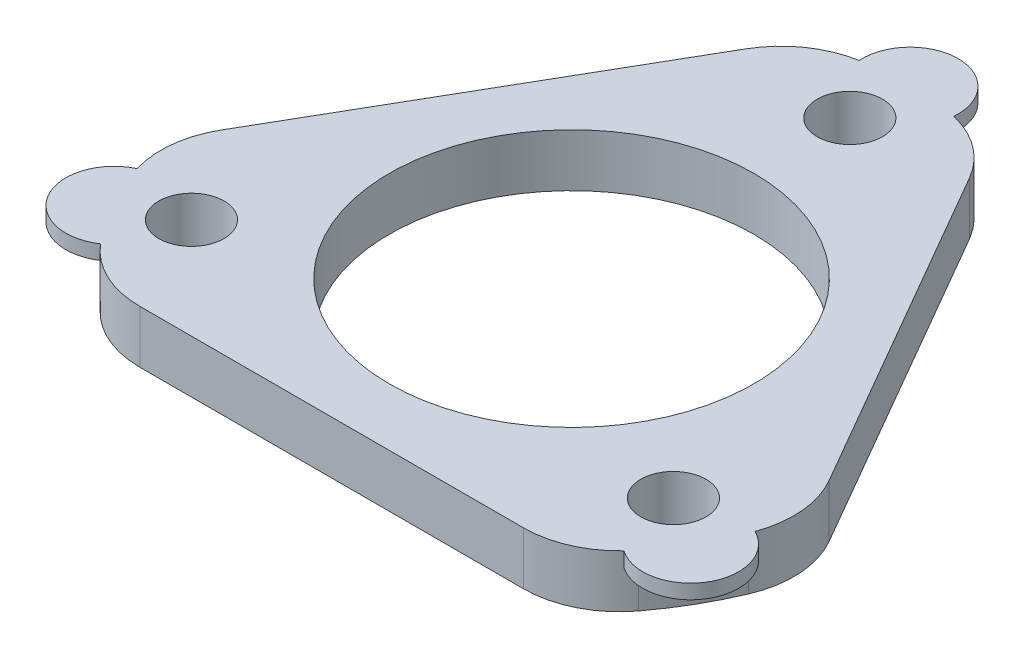
ISO-10303-21;
HEADER;
FILE_DESCRIPTION(('STEP AP214'),'2;1');
FILE_NAME('part.step','',(''),(''),'','','');
FILE_SCHEMA(('AUTOMOTIVE_DESIGN { 1 0 10303 214 1 1 1 1 }'));
ENDSEC;
DATA;
#1=APPLICATION_CONTEXT('core data for automotive mechanical design processes');
#2=APPLICATION_PROTOCOL_DEFINITION('international standard','automotive_design',2000,#1);
#3=PRODUCT_CONTEXT('',#1,'mechanical');
#4=PRODUCT('Part','Part','',(#3));
#5=PRODUCT_RELATED_PRODUCT_CATEGORY('part','',(#4));
#6=PRODUCT_DEFINITION_FORMATION('','',#4);
#7=PRODUCT_DEFINITION_CONTEXT('part definition',#1,'design');
#8=PRODUCT_DEFINITION('design','',#6,#7);
#9=PRODUCT_DEFINITION_SHAPE('','',#8);
#10=(LENGTH_UNIT() NAMED_UNIT(*) SI_UNIT(.MILLI.,.METRE.));
#11=(NAMED_UNIT(*) PLANE_ANGLE_UNIT() SI_UNIT($,.RADIAN.));
#12=(NAMED_UNIT(*) SI_UNIT($,.STERADIAN.) SOLID_ANGLE_UNIT());
#13=UNCERTAINTY_MEASURE_WITH_UNIT(LENGTH_MEASURE(1.E-05),#10,'distance_accuracy_value','');
#14=(GEOMETRIC_REPRESENTATION_CONTEXT(3) GLOBAL_UNCERTAINTY_ASSIGNED_CONTEXT((#13)) GLOBAL_UNIT_ASSIGNED_CONTEXT((#10,
#11,#12)) REPRESENTATION_CONTEXT('',''));
#15=CARTESIAN_POINT('',(0.,0.,0.));
#16=DIRECTION('',(0.,0.,1.));
#17=DIRECTION('',(1.,0.,0.));
#18=AXIS2_PLACEMENT_3D('',#15,#16,#17);
#19=CARTESIAN_POINT('',(0.,5.5,0.));
#20=DIRECTION('',(0.,1.,0.));
#21=DIRECTION('',(0.,0.,1.));
#22=AXIS2_PLACEMENT_3D('',#19,#20,#21);
#23=PLANE('',#22);
#24=CARTESIAN_POINT('',(0.,5.5,0.));
#25=DIRECTION('',(0.,1.,0.));
#26=DIRECTION('',(0.,0.,1.));
#27=AXIS2_PLACEMENT_3D('',#24,#25,#26);
#28=CIRCLE('',#27,19.);
#29=CARTESIAN_POINT('',(0.,5.5,19.));
#30=VERTEX_POINT('',#29);
#31=EDGE_CURVE('E560',#30,#30,#28,.T.);
#32=ORIENTED_EDGE('',*,*,#31,.F.);
#33=EDGE_LOOP('',(#32));
#34=FACE_BOUND('',#33,.T.);
#35=CARTESIAN_POINT('',(0.,5.5,-29.));
#36=DIRECTION('',(0.,1.,0.));
#37=DIRECTION('',(0.,0.,1.));
#38=AXIS2_PLACEMENT_3D('',#35,#36,#37);
#39=CIRCLE('',#38,3.4);
#40=CARTESIAN_POINT('',(0.,5.5,-25.6));
#41=VERTEX_POINT('',#40);
#42=EDGE_CURVE('E277',#41,#41,#39,.T.);
#43=ORIENTED_EDGE('',*,*,#42,.F.);
#44=EDGE_LOOP('',(#43));
#45=FACE_BOUND('',#44,.T.);
#46=CARTESIAN_POINT('',(25.1147367097487,5.5,14.5));
#47=DIRECTION('',(0.,1.,0.));
#48=DIRECTION('',(0.,0.,1.));
#49=AXIS2_PLACEMENT_3D('',#46,#47,#48);
#50=CIRCLE('',#49,3.4);
#51=CARTESIAN_POINT('',(25.1147367097487,5.5,17.9));
#52=VERTEX_POINT('',#51);
#53=EDGE_CURVE('E563',#52,#52,#50,.T.);
#54=ORIENTED_EDGE('',*,*,#53,.F.);
#55=EDGE_LOOP('',(#54));
#56=FACE_BOUND('',#55,.T.);
#57=CARTESIAN_POINT('',(-25.1147367097487,5.5,14.5));
#58=DIRECTION('',(0.,1.,0.));
#59=DIRECTION('',(0.,0.,1.));
#60=AXIS2_PLACEMENT_3D('',#57,#58,#59);
#61=CIRCLE('',#60,3.4);
#62=CARTESIAN_POINT('',(-25.1147367097487,5.5,17.9));
#63=VERTEX_POINT('',#62);
#64=EDGE_CURVE('E292',#63,#63,#61,.T.);
#65=ORIENTED_EDGE('',*,*,#64,.F.);
#66=EDGE_LOOP('',(#65));
#67=FACE_BOUND('',#66,.T.);
#68=CARTESIAN_POINT('',(-30.4536294819663,5.5,17.2504043829445));
#69=DIRECTION('',(0.,1.,0.));
#70=DIRECTION('',(0.,0.,1.));
#71=AXIS2_PLACEMENT_3D('',#68,#69,#70);
#72=CIRCLE('',#71,5.);
#73=CARTESIAN_POINT('',(-32.5618339352836,5.5,12.7165898760405));
#74=VERTEX_POINT('',#73);
#75=CARTESIAN_POINT('',(-27.6767457832055,5.5,21.4083987219927));
#76=VERTEX_POINT('',#75);
#77=EDGE_CURVE('E302',#74,#76,#72,.T.);
#78=ORIENTED_EDGE('',*,*,#77,.T.);
#79=CARTESIAN_POINT('',(-20.,5.5,15.));
#80=DIRECTION('',(0.,1.,0.));
#81=DIRECTION('',(0.,0.,1.));
#82=AXIS2_PLACEMENT_3D('',#79,#80,#81);
#83=CIRCLE('',#82,10.);
#84=CARTESIAN_POINT('',(-20.,5.5,25.));
#85=VERTEX_POINT('',#84);
#86=EDGE_CURVE('E224',#76,#85,#83,.T.);
#87=ORIENTED_EDGE('',*,*,#86,.T.);
#88=DIRECTION('',(1.,0.,0.));
#89=VECTOR('',#88,1.);
#90=CARTESIAN_POINT('',(-43.301270189222,5.5,25.));
#91=LINE('',#90,#89);
#92=CARTESIAN_POINT('',(20.,5.5,25.));
#93=VERTEX_POINT('',#92);
#94=EDGE_CURVE('E183',#85,#93,#91,.T.);
#95=ORIENTED_EDGE('',*,*,#94,.T.);
#96=CARTESIAN_POINT('',(20.,5.5,15.));
#97=DIRECTION('',(0.,1.,0.));
#98=DIRECTION('',(0.,0.,1.));
#99=AXIS2_PLACEMENT_3D('',#96,#97,#98);
#100=CIRCLE('',#99,10.);
#101=CARTESIAN_POINT('',(27.2938068498009,5.5,21.8410804437455));
#102=VERTEX_POINT('',#101);
#103=EDGE_CURVE('E218',#93,#102,#100,.T.);
#104=ORIENTED_EDGE('',*,*,#103,.T.);
#105=CARTESIAN_POINT('',(30.1661031621676,5.5,17.7484145773493));
#106=DIRECTION('',(0.,1.,0.));
#107=DIRECTION('',(0.,0.,1.));
#108=AXIS2_PLACEMENT_3D('',#105,#106,#107);
#109=CIRCLE('',#108,5.);
#110=CARTESIAN_POINT('',(32.3785900391947,5.5,13.2645655813434));
#111=VERTEX_POINT('',#110);
#112=EDGE_CURVE('E296',#102,#111,#109,.T.);
#113=ORIENTED_EDGE('',*,*,#112,.T.);
#114=CARTESIAN_POINT('',(22.9903810567666,5.5,9.82050807568875));
#115=DIRECTION('',(0.,1.,0.));
#116=DIRECTION('',(0.,0.,1.));
#117=AXIS2_PLACEMENT_3D('',#114,#115,#116);
#118=CIRCLE('',#117,10.);
#119=CARTESIAN_POINT('',(31.650635094611,5.5,4.82050807568876));
#120=VERTEX_POINT('',#119);
#121=EDGE_CURVE('E216',#111,#120,#118,.T.);
#122=ORIENTED_EDGE('',*,*,#121,.T.);
#123=DIRECTION('',(-0.5,0.,-0.866025403784438));
#124=VECTOR('',#123,1.);
#125=CARTESIAN_POINT('',(43.301270189222,5.5,25.));
#126=LINE('',#125,#124);
#127=CARTESIAN_POINT('',(11.650635094611,5.5,-29.8205080756888));
#128=VERTEX_POINT('',#127);
#129=EDGE_CURVE('E281',#120,#128,#126,.T.);
#130=ORIENTED_EDGE('',*,*,#129,.T.);
#131=CARTESIAN_POINT('',(2.9903810567666,5.5,-24.8205080756888));
#132=DIRECTION('',(0.,1.,0.));
#133=DIRECTION('',(0.,0.,1.));
#134=AXIS2_PLACEMENT_3D('',#131,#132,#133);
#135=CIRCLE('',#134,10.);
#136=CARTESIAN_POINT('',(5.26802708548266,5.5,-34.5576703197861));
#137=VERTEX_POINT('',#136);
#138=EDGE_CURVE('E213',#128,#137,#135,.T.);
#139=ORIENTED_EDGE('',*,*,#138,.T.);
#140=CARTESIAN_POINT('',(0.287526319798734,5.5,-34.9988189602938));
#141=DIRECTION('',(0.,1.,0.));
#142=DIRECTION('',(0.,0.,1.));
#143=AXIS2_PLACEMENT_3D('',#140,#141,#142);
#144=CIRCLE('',#143,5.);
#145=CARTESIAN_POINT('',(-4.70184425598925,5.5,-34.6729643033361));
#146=VERTEX_POINT('',#145);
#147=EDGE_CURVE('E299',#137,#146,#144,.T.);
#148=ORIENTED_EDGE('',*,*,#147,.T.);
#149=CARTESIAN_POINT('',(-2.99038105676657,5.5,-24.8205080756888));
#150=DIRECTION('',(0.,1.,0.));
#151=DIRECTION('',(0.,0.,1.));
#152=AXIS2_PLACEMENT_3D('',#149,#150,#151);
#153=CIRCLE('',#152,10.);
#154=CARTESIAN_POINT('',(-11.650635094611,5.5,-29.8205080756888));
#155=VERTEX_POINT('',#154);
#156=EDGE_CURVE('E211',#146,#155,#153,.T.);
#157=ORIENTED_EDGE('',*,*,#156,.T.);
#158=DIRECTION('',(-0.5,0.,0.866025403784438));
#159=VECTOR('',#158,1.);
#160=CARTESIAN_POINT('',(0.,5.5,-50.));
#161=LINE('',#160,#159);
#162=CARTESIAN_POINT('',(-31.650635094611,5.5,4.82050807568876));
#163=VERTEX_POINT('',#162);
#164=EDGE_CURVE('E285',#155,#163,#161,.T.);
#165=ORIENTED_EDGE('',*,*,#164,.T.);
#166=CARTESIAN_POINT('',(-22.9903810567666,5.5,9.82050807568877));
#167=DIRECTION('',(0.,1.,0.));
#168=DIRECTION('',(0.,0.,1.));
#169=AXIS2_PLACEMENT_3D('',#166,#167,#168);
#170=CIRCLE('',#169,10.);
#171=EDGE_CURVE('E221',#163,#74,#170,.T.);
#172=ORIENTED_EDGE('',*,*,#171,.T.);
#173=EDGE_LOOP('',(#78,#87,#95,#104,#113,#122,#130,#139,#148,#157,#165,#172));
#174=FACE_BOUND('',#173,.T.);
#175=ADVANCED_FACE('F37',(#34,#45,#56,#67,#174),#23,.T.);
#176=CARTESIAN_POINT('',(0.,5.5,0.));
#177=DIRECTION('',(0.,-1.,0.));
#178=DIRECTION('',(0.,0.,-1.));
#179=AXIS2_PLACEMENT_3D('',#176,#177,#178);
#180=CYLINDRICAL_SURFACE('',#179,35.);
#181=CARTESIAN_POINT('',(0.,4.,0.));
#182=DIRECTION('',(0.,1.,0.));
#183=DIRECTION('',(0.,0.,1.));
#184=AXIS2_PLACEMENT_3D('',#181,#182,#183);
#185=CIRCLE('',#184,35.);
#186=CARTESIAN_POINT('',(28.,4.,21.));
#187=VERTEX_POINT('',#186);
#188=CARTESIAN_POINT('',(32.1865334794732,4.,13.7487113059643));
#189=VERTEX_POINT('',#188);
#190=EDGE_CURVE('E197',#187,#189,#185,.T.);
#191=ORIENTED_EDGE('',*,*,#190,.F.);
#192=DIRECTION('',(0.,-1.,0.));
#193=VECTOR('',#192,1.);
#194=CARTESIAN_POINT('',(28.,5.5,21.));
#195=LINE('',#194,#193);
#196=CARTESIAN_POINT('',(28.,0.,21.));
#197=VERTEX_POINT('',#196);
#198=EDGE_CURVE('E234',#187,#197,#195,.T.);
#199=ORIENTED_EDGE('',*,*,#198,.T.);
#200=CARTESIAN_POINT('',(0.,0.,0.));
#201=DIRECTION('',(0.,1.,0.));
#202=DIRECTION('',(0.,0.,1.));
#203=AXIS2_PLACEMENT_3D('',#200,#201,#202);
#204=CIRCLE('',#203,35.);
#205=CARTESIAN_POINT('',(32.1865334794732,0.,13.7487113059643));
#206=VERTEX_POINT('',#205);
#207=EDGE_CURVE('E311',#197,#206,#204,.T.);
#208=ORIENTED_EDGE('',*,*,#207,.T.);
#209=DIRECTION('',(0.,-1.,0.));
#210=VECTOR('',#209,1.);
#211=CARTESIAN_POINT('',(32.1865334794732,5.5,13.7487113059643));
#212=LINE('',#211,#210);
#213=EDGE_CURVE('E232',#206,#189,#212,.F.);
#214=ORIENTED_EDGE('',*,*,#213,.T.);
#215=EDGE_LOOP('',(#191,#199,#208,#214));
#216=FACE_BOUND('',#215,.T.);
#217=ADVANCED_FACE('F337',(#216),#180,.T.);
#218=CARTESIAN_POINT('',(0.,4.,0.));
#219=DIRECTION('',(0.,1.,0.));
#220=DIRECTION('',(0.,0.,1.));
#221=AXIS2_PLACEMENT_3D('',#218,#219,#220);
#222=CIRCLE('',#221,35.);
#223=CARTESIAN_POINT('',(4.18653347947323,4.,-34.7487113059643));
#224=VERTEX_POINT('',#223);
#225=CARTESIAN_POINT('',(-4.1865334794732,4.,-34.7487113059643));
#226=VERTEX_POINT('',#225);
#227=EDGE_CURVE('E315',#224,#226,#222,.T.);
#228=ORIENTED_EDGE('',*,*,#227,.F.);
#229=DIRECTION('',(0.,-1.,0.));
#230=VECTOR('',#229,1.);
#231=CARTESIAN_POINT('',(4.18653347947323,5.5,-34.7487113059643));
#232=LINE('',#231,#230);
#233=CARTESIAN_POINT('',(4.18653347947323,0.,-34.7487113059643));
#234=VERTEX_POINT('',#233);
#235=EDGE_CURVE('E244',#224,#234,#232,.T.);
#236=ORIENTED_EDGE('',*,*,#235,.T.);
#237=CARTESIAN_POINT('',(-4.1865334794732,0.,-34.7487113059643));
#238=VERTEX_POINT('',#237);
#239=EDGE_CURVE('E308',#234,#238,#204,.T.);
#240=ORIENTED_EDGE('',*,*,#239,.T.);
#241=DIRECTION('',(0.,-1.,0.));
#242=VECTOR('',#241,1.);
#243=CARTESIAN_POINT('',(-4.1865334794732,5.5,-34.7487113059643));
#244=LINE('',#243,#242);
#245=EDGE_CURVE('E242',#238,#226,#244,.F.);
#246=ORIENTED_EDGE('',*,*,#245,.T.);
#247=EDGE_LOOP('',(#228,#236,#240,#246));
#248=FACE_BOUND('',#247,.T.);
#249=ADVANCED_FACE('F363',(#248),#180,.T.);
#250=CARTESIAN_POINT('',(-32.1865334794732,0.,13.7487113059643));
#251=VERTEX_POINT('',#250);
#252=CARTESIAN_POINT('',(-28.,0.,21.));
#253=VERTEX_POINT('',#252);
#254=EDGE_CURVE('E306',#251,#253,#204,.T.);
#255=ORIENTED_EDGE('',*,*,#254,.T.);
#256=DIRECTION('',(0.,-1.,0.));
#257=VECTOR('',#256,1.);
#258=CARTESIAN_POINT('',(-28.,5.5,21.));
#259=LINE('',#258,#257);
#260=CARTESIAN_POINT('',(-28.,4.,21.));
#261=VERTEX_POINT('',#260);
#262=EDGE_CURVE('E167',#253,#261,#259,.F.);
#263=ORIENTED_EDGE('',*,*,#262,.T.);
#264=CARTESIAN_POINT('',(0.,4.,0.));
#265=DIRECTION('',(0.,1.,0.));
#266=DIRECTION('',(0.,0.,1.));
#267=AXIS2_PLACEMENT_3D('',#264,#265,#266);
#268=CIRCLE('',#267,35.);
#269=CARTESIAN_POINT('',(-32.1865334794732,4.,13.7487113059643));
#270=VERTEX_POINT('',#269);
#271=EDGE_CURVE('E312',#270,#261,#268,.T.);
#272=ORIENTED_EDGE('',*,*,#271,.F.);
#273=DIRECTION('',(0.,-1.,0.));
#274=VECTOR('',#273,1.);
#275=CARTESIAN_POINT('',(-32.1865334794732,5.5,13.7487113059643));
#276=LINE('',#275,#274);
#277=EDGE_CURVE('E172',#270,#251,#276,.T.);
#278=ORIENTED_EDGE('',*,*,#277,.T.);
#279=EDGE_LOOP('',(#255,#263,#272,#278));
#280=FACE_BOUND('',#279,.T.);
#281=ADVANCED_FACE('F340',(#280),#180,.T.);
#282=CARTESIAN_POINT('',(0.,0.,0.));
#283=DIRECTION('',(0.,1.,0.));
#284=DIRECTION('',(0.,0.,1.));
#285=AXIS2_PLACEMENT_3D('',#282,#283,#284);
#286=PLANE('',#285);
#287=CARTESIAN_POINT('',(0.,0.,0.));
#288=DIRECTION('',(0.,1.,0.));
#289=DIRECTION('',(0.,0.,1.));
#290=AXIS2_PLACEMENT_3D('',#287,#288,#289);
#291=CIRCLE('',#290,19.);
#292=CARTESIAN_POINT('',(0.,0.,19.));
#293=VERTEX_POINT('',#292);
#294=EDGE_CURVE('E41',#293,#293,#291,.T.);
#295=ORIENTED_EDGE('',*,*,#294,.T.);
#296=EDGE_LOOP('',(#295));
#297=FACE_BOUND('',#296,.T.);
#298=CARTESIAN_POINT('',(0.,0.,-29.));
#299=DIRECTION('',(0.,1.,0.));
#300=DIRECTION('',(0.,0.,1.));
#301=AXIS2_PLACEMENT_3D('',#298,#299,#300);
#302=CIRCLE('',#301,3.4);
#303=CARTESIAN_POINT('',(0.,0.,-25.6));
#304=VERTEX_POINT('',#303);
#305=EDGE_CURVE('E279',#304,#304,#302,.T.);
#306=ORIENTED_EDGE('',*,*,#305,.T.);
#307=EDGE_LOOP('',(#306));
#308=FACE_BOUND('',#307,.T.);
#309=CARTESIAN_POINT('',(25.1147367097487,0.,14.5));
#310=DIRECTION('',(0.,1.,0.));
#311=DIRECTION('',(0.,0.,1.));
#312=AXIS2_PLACEMENT_3D('',#309,#310,#311);
#313=CIRCLE('',#312,3.4);
#314=CARTESIAN_POINT('',(25.1147367097487,0.,17.9));
#315=VERTEX_POINT('',#314);
#316=EDGE_CURVE('E276',#315,#315,#313,.T.);
#317=ORIENTED_EDGE('',*,*,#316,.T.);
#318=EDGE_LOOP('',(#317));
#319=FACE_BOUND('',#318,.T.);
#320=CARTESIAN_POINT('',(-25.1147367097487,0.,14.5));
#321=DIRECTION('',(0.,1.,0.));
#322=DIRECTION('',(0.,0.,1.));
#323=AXIS2_PLACEMENT_3D('',#320,#321,#322);
#324=CIRCLE('',#323,3.4);
#325=CARTESIAN_POINT('',(-25.1147367097487,0.,17.9));
#326=VERTEX_POINT('',#325);
#327=EDGE_CURVE('E273',#326,#326,#324,.T.);
#328=ORIENTED_EDGE('',*,*,#327,.T.);
#329=EDGE_LOOP('',(#328));
#330=FACE_BOUND('',#329,.T.);
#331=DIRECTION('',(1.,0.,0.));
#332=VECTOR('',#331,1.);
#333=CARTESIAN_POINT('',(0.,0.,25.));
#334=LINE('',#333,#332);
#335=CARTESIAN_POINT('',(-20.,0.,25.));
#336=VERTEX_POINT('',#335);
#337=CARTESIAN_POINT('',(20.,0.,25.));
#338=VERTEX_POINT('',#337);
#339=EDGE_CURVE('E180',#336,#338,#334,.T.);
#340=ORIENTED_EDGE('',*,*,#339,.F.);
#341=CARTESIAN_POINT('',(-20.,0.,15.));
#342=DIRECTION('',(0.,1.,0.));
#343=DIRECTION('',(0.,0.,1.));
#344=AXIS2_PLACEMENT_3D('',#341,#342,#343);
#345=CIRCLE('',#344,10.);
#346=EDGE_CURVE('E161',#336,#253,#345,.F.);
#347=ORIENTED_EDGE('',*,*,#346,.T.);
#348=ORIENTED_EDGE('',*,*,#254,.F.);
#349=CARTESIAN_POINT('',(-22.9903810567666,0.,9.82050807568877));
#350=DIRECTION('',(0.,1.,0.));
#351=DIRECTION('',(0.,0.,1.));
#352=AXIS2_PLACEMENT_3D('',#349,#350,#351);
#353=CIRCLE('',#352,10.);
#354=CARTESIAN_POINT('',(-31.650635094611,0.,4.82050807568878));
#355=VERTEX_POINT('',#354);
#356=EDGE_CURVE('E173',#251,#355,#353,.F.);
#357=ORIENTED_EDGE('',*,*,#356,.T.);
#358=DIRECTION('',(-0.5,0.,0.866025403784439));
#359=VECTOR('',#358,1.);
#360=CARTESIAN_POINT('',(-21.650635094611,0.,-12.5));
#361=LINE('',#360,#359);
#362=CARTESIAN_POINT('',(-11.650635094611,0.,-29.8205080756888));
#363=VERTEX_POINT('',#362);
#364=EDGE_CURVE('E192',#363,#355,#361,.T.);
#365=ORIENTED_EDGE('',*,*,#364,.F.);
#366=CARTESIAN_POINT('',(-2.99038105676657,0.,-24.8205080756888));
#367=DIRECTION('',(0.,1.,0.));
#368=DIRECTION('',(0.,0.,1.));
#369=AXIS2_PLACEMENT_3D('',#366,#367,#368);
#370=CIRCLE('',#369,10.);
#371=EDGE_CURVE('E184',#363,#238,#370,.F.);
#372=ORIENTED_EDGE('',*,*,#371,.T.);
#373=ORIENTED_EDGE('',*,*,#239,.F.);
#374=CARTESIAN_POINT('',(2.9903810567666,0.,-24.8205080756888));
#375=DIRECTION('',(0.,1.,0.));
#376=DIRECTION('',(0.,0.,1.));
#377=AXIS2_PLACEMENT_3D('',#374,#375,#376);
#378=CIRCLE('',#377,10.);
#379=CARTESIAN_POINT('',(11.650635094611,0.,-29.8205080756888));
#380=VERTEX_POINT('',#379);
#381=EDGE_CURVE('E203',#234,#380,#378,.F.);
#382=ORIENTED_EDGE('',*,*,#381,.T.);
#383=DIRECTION('',(-0.5,0.,-0.866025403784439));
#384=VECTOR('',#383,1.);
#385=CARTESIAN_POINT('',(21.650635094611,0.,-12.5));
#386=LINE('',#385,#384);
#387=CARTESIAN_POINT('',(31.650635094611,0.,4.82050807568876));
#388=VERTEX_POINT('',#387);
#389=EDGE_CURVE('E191',#388,#380,#386,.T.);
#390=ORIENTED_EDGE('',*,*,#389,.F.);
#391=CARTESIAN_POINT('',(22.9903810567666,0.,9.82050807568875));
#392=DIRECTION('',(0.,1.,0.));
#393=DIRECTION('',(0.,0.,1.));
#394=AXIS2_PLACEMENT_3D('',#391,#392,#393);
#395=CIRCLE('',#394,10.);
#396=EDGE_CURVE('E205',#388,#206,#395,.F.);
#397=ORIENTED_EDGE('',*,*,#396,.T.);
#398=ORIENTED_EDGE('',*,*,#207,.F.);
#399=CARTESIAN_POINT('',(20.,0.,15.));
#400=DIRECTION('',(0.,1.,0.));
#401=DIRECTION('',(0.,0.,1.));
#402=AXIS2_PLACEMENT_3D('',#399,#400,#401);
#403=CIRCLE('',#402,10.);
#404=EDGE_CURVE('E190',#197,#338,#403,.F.);
#405=ORIENTED_EDGE('',*,*,#404,.T.);
#406=EDGE_LOOP('',(#340,#347,#348,#357,#365,#372,#373,#382,#390,#397,#398,#405));
#407=FACE_BOUND('',#406,.T.);
#408=ADVANCED_FACE('F187',(#297,#308,#319,#330,#407),#286,.F.);
#409=CARTESIAN_POINT('',(-30.4536294819663,4.,17.2504043829445));
#410=DIRECTION('',(0.,1.,0.));
#411=DIRECTION('',(0.,0.,1.));
#412=AXIS2_PLACEMENT_3D('',#409,#410,#411);
#413=CYLINDRICAL_SURFACE('',#412,5.);
#414=ORIENTED_EDGE('',*,*,#77,.F.);
#415=DIRECTION('',(0.,1.,0.));
#416=VECTOR('',#415,1.);
#417=CARTESIAN_POINT('',(-32.5618339352836,5.5,12.7165898760405));
#418=LINE('',#417,#416);
#419=CARTESIAN_POINT('',(-32.5618339352836,4.,12.7165898760405));
#420=VERTEX_POINT('',#419);
#421=EDGE_CURVE('E252',#74,#420,#418,.F.);
#422=ORIENTED_EDGE('',*,*,#421,.T.);
#423=CARTESIAN_POINT('',(-30.4536294819663,4.,17.2504043829445));
#424=DIRECTION('',(0.,1.,0.));
#425=DIRECTION('',(0.,0.,1.));
#426=AXIS2_PLACEMENT_3D('',#423,#424,#425);
#427=CIRCLE('',#426,5.);
#428=CARTESIAN_POINT('',(-27.6767457832055,4.,21.4083987219927));
#429=VERTEX_POINT('',#428);
#430=EDGE_CURVE('E304',#420,#429,#427,.T.);
#431=ORIENTED_EDGE('',*,*,#430,.T.);
#432=DIRECTION('',(0.,1.,0.));
#433=VECTOR('',#432,1.);
#434=CARTESIAN_POINT('',(-27.6767457832055,4.,21.4083987219927));
#435=LINE('',#434,#433);
#436=EDGE_CURVE('E249',#429,#76,#435,.T.);
#437=ORIENTED_EDGE('',*,*,#436,.T.);
#438=EDGE_LOOP('',(#414,#422,#431,#437));
#439=FACE_BOUND('',#438,.T.);
#440=ADVANCED_FACE('F395',(#439),#413,.T.);
#441=CARTESIAN_POINT('',(-30.4536294819663,4.,17.2504043829445));
#442=DIRECTION('',(0.,1.,0.));
#443=DIRECTION('',(0.,0.,1.));
#444=AXIS2_PLACEMENT_3D('',#441,#442,#443);
#445=PLANE('',#444);
#446=ORIENTED_EDGE('',*,*,#430,.F.);
#447=CARTESIAN_POINT('',(-22.9903810567666,4.,9.82050807568877));
#448=DIRECTION('',(0.,1.,0.));
#449=DIRECTION('',(0.,0.,1.));
#450=AXIS2_PLACEMENT_3D('',#447,#448,#449);
#451=CIRCLE('',#450,10.);
#452=EDGE_CURVE('E255',#420,#270,#451,.T.);
#453=ORIENTED_EDGE('',*,*,#452,.T.);
#454=ORIENTED_EDGE('',*,*,#271,.T.);
#455=CARTESIAN_POINT('',(-20.,4.,15.));
#456=DIRECTION('',(0.,1.,0.));
#457=DIRECTION('',(0.,0.,1.));
#458=AXIS2_PLACEMENT_3D('',#455,#456,#457);
#459=CIRCLE('',#458,10.);
#460=EDGE_CURVE('E246',#261,#429,#459,.T.);
#461=ORIENTED_EDGE('',*,*,#460,.T.);
#462=EDGE_LOOP('',(#446,#453,#454,#461));
#463=FACE_BOUND('',#462,.T.);
#464=ADVANCED_FACE('F437',(#463),#445,.F.);
#465=CARTESIAN_POINT('',(0.287526319798734,4.,-34.9988189602938));
#466=DIRECTION('',(0.,1.,0.));
#467=DIRECTION('',(0.,0.,1.));
#468=AXIS2_PLACEMENT_3D('',#465,#466,#467);
#469=CYLINDRICAL_SURFACE('',#468,5.);
#470=ORIENTED_EDGE('',*,*,#147,.F.);
#471=DIRECTION('',(0.,1.,0.));
#472=VECTOR('',#471,1.);
#473=CARTESIAN_POINT('',(5.26802708548266,5.5,-34.5576703197861));
#474=LINE('',#473,#472);
#475=CARTESIAN_POINT('',(5.26802708548266,4.,-34.5576703197861));
#476=VERTEX_POINT('',#475);
#477=EDGE_CURVE('E268',#137,#476,#474,.F.);
#478=ORIENTED_EDGE('',*,*,#477,.T.);
#479=CARTESIAN_POINT('',(0.287526319798734,4.,-34.9988189602938));
#480=DIRECTION('',(0.,1.,0.));
#481=DIRECTION('',(0.,0.,1.));
#482=AXIS2_PLACEMENT_3D('',#479,#480,#481);
#483=CIRCLE('',#482,5.);
#484=CARTESIAN_POINT('',(-4.70184425598925,4.,-34.6729643033361));
#485=VERTEX_POINT('',#484);
#486=EDGE_CURVE('E53',#476,#485,#483,.T.);
#487=ORIENTED_EDGE('',*,*,#486,.T.);
#488=DIRECTION('',(0.,1.,0.));
#489=VECTOR('',#488,1.);
#490=CARTESIAN_POINT('',(-4.70184425598925,4.,-34.6729643033361));
#491=LINE('',#490,#489);
#492=EDGE_CURVE('E11',#485,#146,#491,.T.);
#493=ORIENTED_EDGE('',*,*,#492,.T.);
#494=EDGE_LOOP('',(#470,#478,#487,#493));
#495=FACE_BOUND('',#494,.T.);
#496=ADVANCED_FACE('F434',(#495),#469,.T.);
#497=CARTESIAN_POINT('',(0.287526319798734,4.,-34.9988189602938));
#498=DIRECTION('',(0.,1.,0.));
#499=DIRECTION('',(0.,0.,1.));
#500=AXIS2_PLACEMENT_3D('',#497,#498,#499);
#501=PLANE('',#500);
#502=ORIENTED_EDGE('',*,*,#486,.F.);
#503=CARTESIAN_POINT('',(2.9903810567666,4.,-24.8205080756888));
#504=DIRECTION('',(0.,1.,0.));
#505=DIRECTION('',(0.,0.,1.));
#506=AXIS2_PLACEMENT_3D('',#503,#504,#505);
#507=CIRCLE('',#506,10.);
#508=EDGE_CURVE('E270',#476,#224,#507,.T.);
#509=ORIENTED_EDGE('',*,*,#508,.T.);
#510=ORIENTED_EDGE('',*,*,#227,.T.);
#511=CARTESIAN_POINT('',(-2.99038105676657,4.,-24.8205080756888));
#512=DIRECTION('',(0.,1.,0.));
#513=DIRECTION('',(0.,0.,1.));
#514=AXIS2_PLACEMENT_3D('',#511,#512,#513);
#515=CIRCLE('',#514,10.);
#516=EDGE_CURVE('E46',#226,#485,#515,.T.);
#517=ORIENTED_EDGE('',*,*,#516,.T.);
#518=EDGE_LOOP('',(#502,#509,#510,#517));
#519=FACE_BOUND('',#518,.T.);
#520=ADVANCED_FACE('F365',(#519),#501,.F.);
#521=CARTESIAN_POINT('',(30.1661031621676,4.,17.7484145773493));
#522=DIRECTION('',(0.,1.,0.));
#523=DIRECTION('',(0.,0.,1.));
#524=AXIS2_PLACEMENT_3D('',#521,#522,#523);
#525=CYLINDRICAL_SURFACE('',#524,5.);
#526=ORIENTED_EDGE('',*,*,#112,.F.);
#527=DIRECTION('',(0.,1.,0.));
#528=VECTOR('',#527,1.);
#529=CARTESIAN_POINT('',(27.2938068498009,5.5,21.8410804437455));
#530=LINE('',#529,#528);
#531=CARTESIAN_POINT('',(27.2938068498009,4.,21.8410804437455));
#532=VERTEX_POINT('',#531);
#533=EDGE_CURVE('E257',#102,#532,#530,.F.);
#534=ORIENTED_EDGE('',*,*,#533,.T.);
#535=CARTESIAN_POINT('',(30.1661031621676,4.,17.7484145773493));
#536=DIRECTION('',(0.,1.,0.));
#537=DIRECTION('',(0.,0.,1.));
#538=AXIS2_PLACEMENT_3D('',#535,#536,#537);
#539=CIRCLE('',#538,5.);
#540=CARTESIAN_POINT('',(32.3785900391947,4.,13.2645655813434));
#541=VERTEX_POINT('',#540);
#542=EDGE_CURVE('E297',#532,#541,#539,.T.);
#543=ORIENTED_EDGE('',*,*,#542,.T.);
#544=DIRECTION('',(0.,1.,0.));
#545=VECTOR('',#544,1.);
#546=CARTESIAN_POINT('',(32.3785900391947,4.,13.2645655813434));
#547=LINE('',#546,#545);
#548=EDGE_CURVE('E265',#541,#111,#547,.T.);
#549=ORIENTED_EDGE('',*,*,#548,.T.);
#550=EDGE_LOOP('',(#526,#534,#543,#549));
#551=FACE_BOUND('',#550,.T.);
#552=ADVANCED_FACE('F332',(#551),#525,.T.);
#553=CARTESIAN_POINT('',(30.1661031621676,4.,17.7484145773493));
#554=DIRECTION('',(0.,1.,0.));
#555=DIRECTION('',(0.,0.,1.));
#556=AXIS2_PLACEMENT_3D('',#553,#554,#555);
#557=PLANE('',#556);
#558=ORIENTED_EDGE('',*,*,#542,.F.);
#559=CARTESIAN_POINT('',(20.,4.,15.));
#560=DIRECTION('',(0.,1.,0.));
#561=DIRECTION('',(0.,0.,1.));
#562=AXIS2_PLACEMENT_3D('',#559,#560,#561);
#563=CIRCLE('',#562,10.);
#564=EDGE_CURVE('E260',#532,#187,#563,.T.);
#565=ORIENTED_EDGE('',*,*,#564,.T.);
#566=ORIENTED_EDGE('',*,*,#190,.T.);
#567=CARTESIAN_POINT('',(22.9903810567666,4.,9.82050807568875));
#568=DIRECTION('',(0.,1.,0.));
#569=DIRECTION('',(0.,0.,1.));
#570=AXIS2_PLACEMENT_3D('',#567,#568,#569);
#571=CIRCLE('',#570,10.);
#572=EDGE_CURVE('E262',#189,#541,#571,.T.);
#573=ORIENTED_EDGE('',*,*,#572,.T.);
#574=EDGE_LOOP('',(#558,#565,#566,#573));
#575=FACE_BOUND('',#574,.T.);
#576=ADVANCED_FACE('F321',(#575),#557,.F.);
#577=CARTESIAN_POINT('',(0.,-16.5,-50.));
#578=DIRECTION('',(-0.866025403784439,0.,-0.5));
#579=DIRECTION('',(-0.5,0.,0.866025403784439));
#580=AXIS2_PLACEMENT_3D('',#577,#578,#579);
#581=PLANE('',#580);
#582=ORIENTED_EDGE('',*,*,#364,.T.);
#583=DIRECTION('',(0.,1.,0.));
#584=VECTOR('',#583,1.);
#585=CARTESIAN_POINT('',(-31.650635094611,5.5,4.82050807568877));
#586=LINE('',#585,#584);
#587=EDGE_CURVE('E229',#355,#163,#586,.T.);
#588=ORIENTED_EDGE('',*,*,#587,.T.);
#589=ORIENTED_EDGE('',*,*,#164,.F.);
#590=DIRECTION('',(0.,1.,0.));
#591=VECTOR('',#590,1.);
#592=CARTESIAN_POINT('',(-11.650635094611,0.,-29.8205080756888));
#593=LINE('',#592,#591);
#594=EDGE_CURVE('E226',#155,#363,#593,.F.);
#595=ORIENTED_EDGE('',*,*,#594,.T.);
#596=EDGE_LOOP('',(#582,#588,#589,#595));
#597=FACE_BOUND('',#596,.T.);
#598=ADVANCED_FACE('F352',(#597),#581,.T.);
#599=CARTESIAN_POINT('',(-43.301270189222,-16.5,25.));
#600=DIRECTION('',(0.,0.,1.));
#601=DIRECTION('',(1.,0.,0.));
#602=AXIS2_PLACEMENT_3D('',#599,#600,#601);
#603=PLANE('',#602);
#604=ORIENTED_EDGE('',*,*,#94,.F.);
#605=DIRECTION('',(0.,1.,0.));
#606=VECTOR('',#605,1.);
#607=CARTESIAN_POINT('',(-20.,0.,25.));
#608=LINE('',#607,#606);
#609=EDGE_CURVE('E166',#85,#336,#608,.F.);
#610=ORIENTED_EDGE('',*,*,#609,.T.);
#611=ORIENTED_EDGE('',*,*,#339,.T.);
#612=DIRECTION('',(0.,1.,0.));
#613=VECTOR('',#612,1.);
#614=CARTESIAN_POINT('',(20.,5.5,25.));
#615=LINE('',#614,#613);
#616=EDGE_CURVE('E185',#338,#93,#615,.T.);
#617=ORIENTED_EDGE('',*,*,#616,.T.);
#618=EDGE_LOOP('',(#604,#610,#611,#617));
#619=FACE_BOUND('',#618,.T.);
#620=ADVANCED_FACE('F178',(#619),#603,.T.);
#621=CARTESIAN_POINT('',(43.301270189222,-16.5,25.));
#622=DIRECTION('',(0.866025403784439,0.,-0.5));
#623=DIRECTION('',(-0.5,0.,-0.866025403784439));
#624=AXIS2_PLACEMENT_3D('',#621,#622,#623);
#625=PLANE('',#624);
#626=ORIENTED_EDGE('',*,*,#129,.F.);
#627=DIRECTION('',(0.,1.,0.));
#628=VECTOR('',#627,1.);
#629=CARTESIAN_POINT('',(31.650635094611,0.,4.82050807568875));
#630=LINE('',#629,#628);
#631=EDGE_CURVE('E239',#120,#388,#630,.F.);
#632=ORIENTED_EDGE('',*,*,#631,.T.);
#633=ORIENTED_EDGE('',*,*,#389,.T.);
#634=DIRECTION('',(0.,1.,0.));
#635=VECTOR('',#634,1.);
#636=CARTESIAN_POINT('',(11.650635094611,5.5,-29.8205080756888));
#637=LINE('',#636,#635);
#638=EDGE_CURVE('E236',#380,#128,#637,.T.);
#639=ORIENTED_EDGE('',*,*,#638,.T.);
#640=EDGE_LOOP('',(#626,#632,#633,#639));
#641=FACE_BOUND('',#640,.T.);
#642=ADVANCED_FACE('F372',(#641),#625,.T.);
#643=CARTESIAN_POINT('',(-20.,5.5,15.));
#644=DIRECTION('',(0.,-1.,0.));
#645=DIRECTION('',(0.,0.,-1.));
#646=AXIS2_PLACEMENT_3D('',#643,#644,#645);
#647=CYLINDRICAL_SURFACE('',#646,10.);
#648=ORIENTED_EDGE('',*,*,#460,.F.);
#649=ORIENTED_EDGE('',*,*,#262,.F.);
#650=ORIENTED_EDGE('',*,*,#346,.F.);
#651=ORIENTED_EDGE('',*,*,#609,.F.);
#652=ORIENTED_EDGE('',*,*,#86,.F.);
#653=ORIENTED_EDGE('',*,*,#436,.F.);
#654=EDGE_LOOP('',(#648,#649,#650,#651,#652,#653));
#655=FACE_BOUND('',#654,.T.);
#656=ADVANCED_FACE('F164',(#655),#647,.T.);
#657=CARTESIAN_POINT('',(-22.9903810567666,5.5,9.82050807568877));
#658=DIRECTION('',(0.,-1.,0.));
#659=DIRECTION('',(0.,0.,-1.));
#660=AXIS2_PLACEMENT_3D('',#657,#658,#659);
#661=CYLINDRICAL_SURFACE('',#660,10.);
#662=ORIENTED_EDGE('',*,*,#356,.F.);
#663=ORIENTED_EDGE('',*,*,#277,.F.);
#664=ORIENTED_EDGE('',*,*,#452,.F.);
#665=ORIENTED_EDGE('',*,*,#421,.F.);
#666=ORIENTED_EDGE('',*,*,#171,.F.);
#667=ORIENTED_EDGE('',*,*,#587,.F.);
#668=EDGE_LOOP('',(#662,#663,#664,#665,#666,#667));
#669=FACE_BOUND('',#668,.T.);
#670=ADVANCED_FACE('F347',(#669),#661,.T.);
#671=CARTESIAN_POINT('',(20.,5.5,15.));
#672=DIRECTION('',(0.,-1.,0.));
#673=DIRECTION('',(0.,0.,-1.));
#674=AXIS2_PLACEMENT_3D('',#671,#672,#673);
#675=CYLINDRICAL_SURFACE('',#674,10.);
#676=ORIENTED_EDGE('',*,*,#404,.F.);
#677=ORIENTED_EDGE('',*,*,#198,.F.);
#678=ORIENTED_EDGE('',*,*,#564,.F.);
#679=ORIENTED_EDGE('',*,*,#533,.F.);
#680=ORIENTED_EDGE('',*,*,#103,.F.);
#681=ORIENTED_EDGE('',*,*,#616,.F.);
#682=EDGE_LOOP('',(#676,#677,#678,#679,#680,#681));
#683=FACE_BOUND('',#682,.T.);
#684=ADVANCED_FACE('F335',(#683),#675,.T.);
#685=CARTESIAN_POINT('',(22.9903810567666,5.5,9.82050807568875));
#686=DIRECTION('',(0.,-1.,0.));
#687=DIRECTION('',(0.,0.,-1.));
#688=AXIS2_PLACEMENT_3D('',#685,#686,#687);
#689=CYLINDRICAL_SURFACE('',#688,10.);
#690=ORIENTED_EDGE('',*,*,#572,.F.);
#691=ORIENTED_EDGE('',*,*,#213,.F.);
#692=ORIENTED_EDGE('',*,*,#396,.F.);
#693=ORIENTED_EDGE('',*,*,#631,.F.);
#694=ORIENTED_EDGE('',*,*,#121,.F.);
#695=ORIENTED_EDGE('',*,*,#548,.F.);
#696=EDGE_LOOP('',(#690,#691,#692,#693,#694,#695));
#697=FACE_BOUND('',#696,.T.);
#698=ADVANCED_FACE('F328',(#697),#689,.T.);
#699=CARTESIAN_POINT('',(2.9903810567666,5.5,-24.8205080756888));
#700=DIRECTION('',(0.,-1.,0.));
#701=DIRECTION('',(0.,0.,-1.));
#702=AXIS2_PLACEMENT_3D('',#699,#700,#701);
#703=CYLINDRICAL_SURFACE('',#702,10.);
#704=ORIENTED_EDGE('',*,*,#381,.F.);
#705=ORIENTED_EDGE('',*,*,#235,.F.);
#706=ORIENTED_EDGE('',*,*,#508,.F.);
#707=ORIENTED_EDGE('',*,*,#477,.F.);
#708=ORIENTED_EDGE('',*,*,#138,.F.);
#709=ORIENTED_EDGE('',*,*,#638,.F.);
#710=EDGE_LOOP('',(#704,#705,#706,#707,#708,#709));
#711=FACE_BOUND('',#710,.T.);
#712=ADVANCED_FACE('F368',(#711),#703,.T.);
#713=CARTESIAN_POINT('',(-2.99038105676657,5.5,-24.8205080756888));
#714=DIRECTION('',(0.,-1.,0.));
#715=DIRECTION('',(0.,0.,-1.));
#716=AXIS2_PLACEMENT_3D('',#713,#714,#715);
#717=CYLINDRICAL_SURFACE('',#716,10.);
#718=ORIENTED_EDGE('',*,*,#516,.F.);
#719=ORIENTED_EDGE('',*,*,#245,.F.);
#720=ORIENTED_EDGE('',*,*,#371,.F.);
#721=ORIENTED_EDGE('',*,*,#594,.F.);
#722=ORIENTED_EDGE('',*,*,#156,.F.);
#723=ORIENTED_EDGE('',*,*,#492,.F.);
#724=EDGE_LOOP('',(#718,#719,#720,#721,#722,#723));
#725=FACE_BOUND('',#724,.T.);
#726=ADVANCED_FACE('F39',(#725),#717,.T.);
#727=CARTESIAN_POINT('',(-25.1147367097487,-4.5,14.5));
#728=DIRECTION('',(0.,1.,0.));
#729=DIRECTION('',(0.,0.,1.));
#730=AXIS2_PLACEMENT_3D('',#727,#728,#729);
#731=CYLINDRICAL_SURFACE('',#730,3.4);
#732=ORIENTED_EDGE('',*,*,#64,.T.);
#733=EDGE_LOOP('',(#732));
#734=FACE_BOUND('',#733,.T.);
#735=ORIENTED_EDGE('',*,*,#327,.F.);
#736=EDGE_LOOP('',(#735));
#737=FACE_BOUND('',#736,.T.);
#738=ADVANCED_FACE('F407',(#734,#737),#731,.F.);
#739=CARTESIAN_POINT('',(25.1147367097487,-4.5,14.5));
#740=DIRECTION('',(0.,1.,0.));
#741=DIRECTION('',(0.,0.,1.));
#742=AXIS2_PLACEMENT_3D('',#739,#740,#741);
#743=CYLINDRICAL_SURFACE('',#742,3.4);
#744=ORIENTED_EDGE('',*,*,#53,.T.);
#745=EDGE_LOOP('',(#744));
#746=FACE_BOUND('',#745,.T.);
#747=ORIENTED_EDGE('',*,*,#316,.F.);
#748=EDGE_LOOP('',(#747));
#749=FACE_BOUND('',#748,.T.);
#750=ADVANCED_FACE('F411',(#746,#749),#743,.F.);
#751=CARTESIAN_POINT('',(0.,-4.5,-29.));
#752=DIRECTION('',(0.,1.,0.));
#753=DIRECTION('',(0.,0.,1.));
#754=AXIS2_PLACEMENT_3D('',#751,#752,#753);
#755=CYLINDRICAL_SURFACE('',#754,3.4);
#756=ORIENTED_EDGE('',*,*,#42,.T.);
#757=EDGE_LOOP('',(#756));
#758=FACE_BOUND('',#757,.T.);
#759=ORIENTED_EDGE('',*,*,#305,.F.);
#760=EDGE_LOOP('',(#759));
#761=FACE_BOUND('',#760,.T.);
#762=ADVANCED_FACE('F417',(#758,#761),#755,.F.);
#763=CARTESIAN_POINT('',(0.,-4.5,0.));
#764=DIRECTION('',(0.,1.,0.));
#765=DIRECTION('',(0.,0.,1.));
#766=AXIS2_PLACEMENT_3D('',#763,#764,#765);
#767=CYLINDRICAL_SURFACE('',#766,19.);
#768=ORIENTED_EDGE('',*,*,#31,.T.);
#769=EDGE_LOOP('',(#768));
#770=FACE_BOUND('',#769,.T.);
#771=ORIENTED_EDGE('',*,*,#294,.F.);
#772=EDGE_LOOP('',(#771));
#773=FACE_BOUND('',#772,.T.);
#774=ADVANCED_FACE('F535',(#770,#773),#767,.F.);
#775=CLOSED_SHELL('',(#175,#217,#249,#281,#408,#440,#464,#496,#520,#552,#576,#598,#620,#642,
#656,#670,#684,#698,#712,#726,#738,#750,#762,#774));
#776=MANIFOLD_SOLID_BREP('B2',#775);
#777=ADVANCED_BREP_SHAPE_REPRESENTATION('',(#18,#776),#14);
#778=SHAPE_DEFINITION_REPRESENTATION(#9,#777);
ENDSEC;
END-ISO-10303-21;
